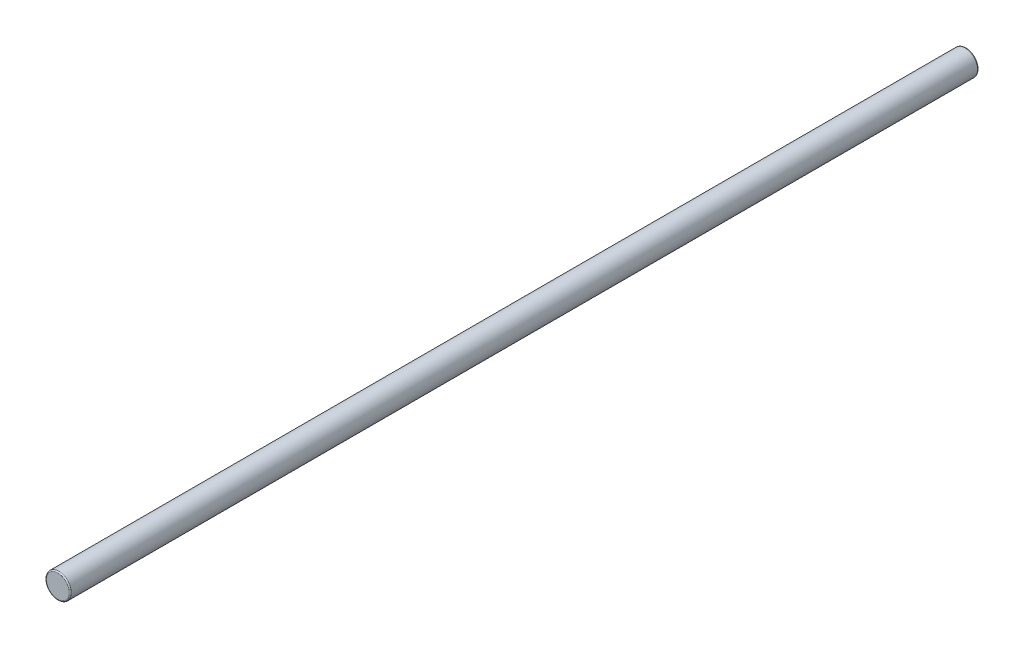
ISO-10303-21;
HEADER;
FILE_DESCRIPTION(('STEP AP214'),'2;1');
FILE_NAME('part.step','',(''),(''),'','','');
FILE_SCHEMA(('AUTOMOTIVE_DESIGN { 1 0 10303 214 1 1 1 1 }'));
ENDSEC;
DATA;
#1=APPLICATION_CONTEXT('core data for automotive mechanical design processes');
#2=APPLICATION_PROTOCOL_DEFINITION('international standard','automotive_design',2000,#1);
#3=PRODUCT_CONTEXT('',#1,'mechanical');
#4=PRODUCT('Part','Part','',(#3));
#5=PRODUCT_RELATED_PRODUCT_CATEGORY('part','',(#4));
#6=PRODUCT_DEFINITION_FORMATION('','',#4);
#7=PRODUCT_DEFINITION_CONTEXT('part definition',#1,'design');
#8=PRODUCT_DEFINITION('design','',#6,#7);
#9=PRODUCT_DEFINITION_SHAPE('','',#8);
#10=(LENGTH_UNIT() NAMED_UNIT(*) SI_UNIT(.MILLI.,.METRE.));
#11=(NAMED_UNIT(*) PLANE_ANGLE_UNIT() SI_UNIT($,.RADIAN.));
#12=(NAMED_UNIT(*) SI_UNIT($,.STERADIAN.) SOLID_ANGLE_UNIT());
#13=UNCERTAINTY_MEASURE_WITH_UNIT(LENGTH_MEASURE(1.E-05),#10,'distance_accuracy_value','');
#14=(GEOMETRIC_REPRESENTATION_CONTEXT(3) GLOBAL_UNCERTAINTY_ASSIGNED_CONTEXT((#13)) GLOBAL_UNIT_ASSIGNED_CONTEXT((#10,
#11,#12)) REPRESENTATION_CONTEXT('',''));
#15=CARTESIAN_POINT('',(0.,0.,0.));
#16=DIRECTION('',(0.,0.,1.));
#17=DIRECTION('',(1.,0.,0.));
#18=AXIS2_PLACEMENT_3D('',#15,#16,#17);
#19=CARTESIAN_POINT('',(0.,0.,40.));
#20=DIRECTION('',(0.,0.,-1.));
#21=DIRECTION('',(-1.,0.,0.));
#22=AXIS2_PLACEMENT_3D('',#19,#20,#21);
#23=CYLINDRICAL_SURFACE('',#22,0.55);
#24=CARTESIAN_POINT('',(0.,0.,0.0500000000000014));
#25=DIRECTION('',(0.,0.,1.));
#26=DIRECTION('',(1.,0.,0.));
#27=AXIS2_PLACEMENT_3D('',#24,#25,#26);
#28=CIRCLE('',#27,0.55);
#29=CARTESIAN_POINT('',(0.55,0.,0.0500000000000014));
#30=VERTEX_POINT('',#29);
#31=EDGE_CURVE('E42',#30,#30,#28,.T.);
#32=ORIENTED_EDGE('',*,*,#31,.T.);
#33=EDGE_LOOP('',(#32));
#34=FACE_BOUND('',#33,.T.);
#35=CARTESIAN_POINT('',(0.,0.,39.95));
#36=DIRECTION('',(0.,0.,1.));
#37=DIRECTION('',(1.,0.,0.));
#38=AXIS2_PLACEMENT_3D('',#35,#36,#37);
#39=CIRCLE('',#38,0.55);
#40=CARTESIAN_POINT('',(0.55,0.,39.95));
#41=VERTEX_POINT('',#40);
#42=EDGE_CURVE('E46',#41,#41,#39,.F.);
#43=ORIENTED_EDGE('',*,*,#42,.T.);
#44=EDGE_LOOP('',(#43));
#45=FACE_BOUND('',#44,.T.);
#46=ADVANCED_FACE('F31',(#34,#45),#23,.T.);
#47=CARTESIAN_POINT('',(0.,0.,40.));
#48=DIRECTION('',(0.,0.,1.));
#49=DIRECTION('',(1.,0.,0.));
#50=AXIS2_PLACEMENT_3D('',#47,#48,#49);
#51=PLANE('',#50);
#52=CARTESIAN_POINT('',(0.,0.,40.));
#53=DIRECTION('',(0.,0.,1.));
#54=DIRECTION('',(1.,0.,0.));
#55=AXIS2_PLACEMENT_3D('',#52,#53,#54);
#56=CIRCLE('',#55,0.5);
#57=CARTESIAN_POINT('',(0.5,0.,40.));
#58=VERTEX_POINT('',#57);
#59=EDGE_CURVE('E10',#58,#58,#56,.T.);
#60=ORIENTED_EDGE('',*,*,#59,.T.);
#61=EDGE_LOOP('',(#60));
#62=FACE_BOUND('',#61,.T.);
#63=ADVANCED_FACE('F62',(#62),#51,.T.);
#64=CARTESIAN_POINT('',(0.,0.,0.));
#65=DIRECTION('',(0.,0.,1.));
#66=DIRECTION('',(1.,0.,0.));
#67=AXIS2_PLACEMENT_3D('',#64,#65,#66);
#68=PLANE('',#67);
#69=CARTESIAN_POINT('',(0.,0.,0.));
#70=DIRECTION('',(0.,0.,1.));
#71=DIRECTION('',(1.,0.,0.));
#72=AXIS2_PLACEMENT_3D('',#69,#70,#71);
#73=CIRCLE('',#72,0.5);
#74=CARTESIAN_POINT('',(0.5,0.,0.));
#75=VERTEX_POINT('',#74);
#76=EDGE_CURVE('E38',#75,#75,#73,.F.);
#77=ORIENTED_EDGE('',*,*,#76,.T.);
#78=EDGE_LOOP('',(#77));
#79=FACE_BOUND('',#78,.T.);
#80=ADVANCED_FACE('F59',(#79),#68,.F.);
#81=CARTESIAN_POINT('',(0.,0.,0.0500000000000014));
#82=DIRECTION('',(0.,0.,1.));
#83=DIRECTION('',(1.,0.,0.));
#84=AXIS2_PLACEMENT_3D('',#81,#82,#83);
#85=TOROIDAL_SURFACE('',#84,0.5,0.05);
#86=ORIENTED_EDGE('',*,*,#76,.F.);
#87=EDGE_LOOP('',(#86));
#88=FACE_BOUND('',#87,.T.);
#89=ORIENTED_EDGE('',*,*,#31,.F.);
#90=EDGE_LOOP('',(#89));
#91=FACE_BOUND('',#90,.T.);
#92=ADVANCED_FACE('F55',(#88,#91),#85,.T.);
#93=CARTESIAN_POINT('',(0.,0.,39.95));
#94=DIRECTION('',(0.,0.,1.));
#95=DIRECTION('',(1.,0.,0.));
#96=AXIS2_PLACEMENT_3D('',#93,#94,#95);
#97=TOROIDAL_SURFACE('',#96,0.5,0.05);
#98=ORIENTED_EDGE('',*,*,#42,.F.);
#99=EDGE_LOOP('',(#98));
#100=FACE_BOUND('',#99,.T.);
#101=ORIENTED_EDGE('',*,*,#59,.F.);
#102=EDGE_LOOP('',(#101));
#103=FACE_BOUND('',#102,.T.);
#104=ADVANCED_FACE('F33',(#100,#103),#97,.T.);
#105=CLOSED_SHELL('',(#46,#63,#80,#92,#104));
#106=MANIFOLD_SOLID_BREP('B2',#105);
#107=ADVANCED_BREP_SHAPE_REPRESENTATION('',(#18,#106),#14);
#108=SHAPE_DEFINITION_REPRESENTATION(#9,#107);
ENDSEC;
END-ISO-10303-21;
